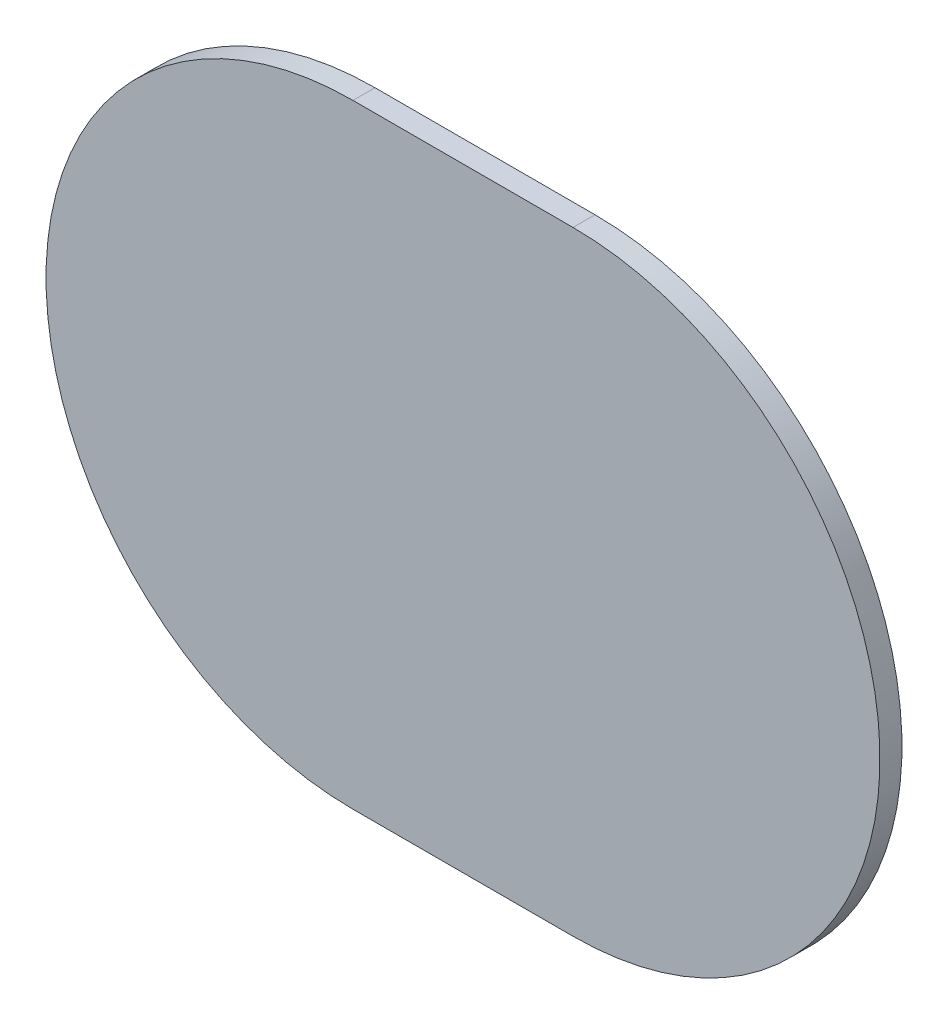
ISO-10303-21;
HEADER;
FILE_DESCRIPTION(('STEP AP214'),'2;1');
FILE_NAME('part.step','',(''),(''),'','','');
FILE_SCHEMA(('AUTOMOTIVE_DESIGN { 1 0 10303 214 1 1 1 1 }'));
ENDSEC;
DATA;
#1=APPLICATION_CONTEXT('core data for automotive mechanical design processes');
#2=APPLICATION_PROTOCOL_DEFINITION('international standard','automotive_design',2000,#1);
#3=PRODUCT_CONTEXT('',#1,'mechanical');
#4=PRODUCT('Part','Part','',(#3));
#5=PRODUCT_RELATED_PRODUCT_CATEGORY('part','',(#4));
#6=PRODUCT_DEFINITION_FORMATION('','',#4);
#7=PRODUCT_DEFINITION_CONTEXT('part definition',#1,'design');
#8=PRODUCT_DEFINITION('design','',#6,#7);
#9=PRODUCT_DEFINITION_SHAPE('','',#8);
#10=(LENGTH_UNIT() NAMED_UNIT(*) SI_UNIT(.MILLI.,.METRE.));
#11=(NAMED_UNIT(*) PLANE_ANGLE_UNIT() SI_UNIT($,.RADIAN.));
#12=(NAMED_UNIT(*) SI_UNIT($,.STERADIAN.) SOLID_ANGLE_UNIT());
#13=UNCERTAINTY_MEASURE_WITH_UNIT(LENGTH_MEASURE(1.E-05),#10,'distance_accuracy_value','');
#14=(GEOMETRIC_REPRESENTATION_CONTEXT(3) GLOBAL_UNCERTAINTY_ASSIGNED_CONTEXT((#13)) GLOBAL_UNIT_ASSIGNED_CONTEXT((#10,
#11,#12)) REPRESENTATION_CONTEXT('',''));
#15=CARTESIAN_POINT('',(0.,0.,0.));
#16=DIRECTION('',(0.,0.,1.));
#17=DIRECTION('',(1.,0.,0.));
#18=AXIS2_PLACEMENT_3D('',#15,#16,#17);
#19=CARTESIAN_POINT('',(-10.,0.,2.));
#20=DIRECTION('',(0.,0.,-1.));
#21=DIRECTION('',(-1.,0.,0.));
#22=AXIS2_PLACEMENT_3D('',#19,#20,#21);
#23=CYLINDRICAL_SURFACE('',#22,27.9);
#24=CARTESIAN_POINT('',(-10.,0.,0.));
#25=DIRECTION('',(0.,0.,1.));
#26=DIRECTION('',(1.,0.,0.));
#27=AXIS2_PLACEMENT_3D('',#24,#25,#26);
#28=CIRCLE('',#27,27.9);
#29=CARTESIAN_POINT('',(-10.,27.9,0.));
#30=VERTEX_POINT('',#29);
#31=CARTESIAN_POINT('',(-10.,-27.9,0.));
#32=VERTEX_POINT('',#31);
#33=EDGE_CURVE('E98',#30,#32,#28,.T.);
#34=ORIENTED_EDGE('',*,*,#33,.T.);
#35=DIRECTION('',(0.,0.,-1.));
#36=VECTOR('',#35,1.);
#37=CARTESIAN_POINT('',(-10.,-27.9,2.));
#38=LINE('',#37,#36);
#39=CARTESIAN_POINT('',(-10.,-27.9,2.));
#40=VERTEX_POINT('',#39);
#41=EDGE_CURVE('E11',#40,#32,#38,.T.);
#42=ORIENTED_EDGE('',*,*,#41,.F.);
#43=CARTESIAN_POINT('',(-10.,0.,2.));
#44=DIRECTION('',(0.,0.,1.));
#45=DIRECTION('',(1.,0.,0.));
#46=AXIS2_PLACEMENT_3D('',#43,#44,#45);
#47=CIRCLE('',#46,27.9);
#48=CARTESIAN_POINT('',(-10.,27.9,2.));
#49=VERTEX_POINT('',#48);
#50=EDGE_CURVE('E86',#49,#40,#47,.T.);
#51=ORIENTED_EDGE('',*,*,#50,.F.);
#52=DIRECTION('',(0.,0.,-1.));
#53=VECTOR('',#52,1.);
#54=CARTESIAN_POINT('',(-10.,27.9,2.));
#55=LINE('',#54,#53);
#56=EDGE_CURVE('E94',#49,#30,#55,.T.);
#57=ORIENTED_EDGE('',*,*,#56,.T.);
#58=EDGE_LOOP('',(#34,#42,#51,#57));
#59=FACE_BOUND('',#58,.T.);
#60=ADVANCED_FACE('F35',(#59),#23,.T.);
#61=CARTESIAN_POINT('',(-10.,-27.9,2.));
#62=DIRECTION('',(0.,1.,0.));
#63=DIRECTION('',(0.,0.,1.));
#64=AXIS2_PLACEMENT_3D('',#61,#62,#63);
#65=PLANE('',#64);
#66=DIRECTION('',(1.,0.,0.));
#67=VECTOR('',#66,1.);
#68=CARTESIAN_POINT('',(-10.,-27.9,0.));
#69=LINE('',#68,#67);
#70=CARTESIAN_POINT('',(10.,-27.9,0.));
#71=VERTEX_POINT('',#70);
#72=EDGE_CURVE('E90',#32,#71,#69,.T.);
#73=ORIENTED_EDGE('',*,*,#72,.T.);
#74=DIRECTION('',(0.,0.,-1.));
#75=VECTOR('',#74,1.);
#76=CARTESIAN_POINT('',(10.,-27.9,2.));
#77=LINE('',#76,#75);
#78=CARTESIAN_POINT('',(10.,-27.9,2.));
#79=VERTEX_POINT('',#78);
#80=EDGE_CURVE('E43',#79,#71,#77,.T.);
#81=ORIENTED_EDGE('',*,*,#80,.F.);
#82=DIRECTION('',(1.,0.,0.));
#83=VECTOR('',#82,1.);
#84=CARTESIAN_POINT('',(-10.,-27.9,2.));
#85=LINE('',#84,#83);
#86=EDGE_CURVE('E81',#40,#79,#85,.T.);
#87=ORIENTED_EDGE('',*,*,#86,.F.);
#88=ORIENTED_EDGE('',*,*,#41,.T.);
#89=EDGE_LOOP('',(#73,#81,#87,#88));
#90=FACE_BOUND('',#89,.T.);
#91=ADVANCED_FACE('F89',(#90),#65,.F.);
#92=CARTESIAN_POINT('',(10.,0.,2.));
#93=DIRECTION('',(0.,0.,-1.));
#94=DIRECTION('',(-1.,0.,0.));
#95=AXIS2_PLACEMENT_3D('',#92,#93,#94);
#96=CYLINDRICAL_SURFACE('',#95,27.9);
#97=CARTESIAN_POINT('',(10.,0.,0.));
#98=DIRECTION('',(0.,0.,1.));
#99=DIRECTION('',(1.,0.,0.));
#100=AXIS2_PLACEMENT_3D('',#97,#98,#99);
#101=CIRCLE('',#100,27.9);
#102=CARTESIAN_POINT('',(10.,27.9,0.));
#103=VERTEX_POINT('',#102);
#104=EDGE_CURVE('E68',#71,#103,#101,.T.);
#105=ORIENTED_EDGE('',*,*,#104,.T.);
#106=DIRECTION('',(0.,0.,-1.));
#107=VECTOR('',#106,1.);
#108=CARTESIAN_POINT('',(10.,27.9,2.));
#109=LINE('',#108,#107);
#110=CARTESIAN_POINT('',(10.,27.9,2.));
#111=VERTEX_POINT('',#110);
#112=EDGE_CURVE('E91',#111,#103,#109,.T.);
#113=ORIENTED_EDGE('',*,*,#112,.F.);
#114=CARTESIAN_POINT('',(10.,0.,2.));
#115=DIRECTION('',(0.,0.,1.));
#116=DIRECTION('',(1.,0.,0.));
#117=AXIS2_PLACEMENT_3D('',#114,#115,#116);
#118=CIRCLE('',#117,27.9);
#119=EDGE_CURVE('E84',#79,#111,#118,.T.);
#120=ORIENTED_EDGE('',*,*,#119,.F.);
#121=ORIENTED_EDGE('',*,*,#80,.T.);
#122=EDGE_LOOP('',(#105,#113,#120,#121));
#123=FACE_BOUND('',#122,.T.);
#124=ADVANCED_FACE('F92',(#123),#96,.T.);
#125=CARTESIAN_POINT('',(10.,27.9,2.));
#126=DIRECTION('',(0.,-1.,0.));
#127=DIRECTION('',(1.,0.,0.));
#128=AXIS2_PLACEMENT_3D('',#125,#126,#127);
#129=PLANE('',#128);
#130=DIRECTION('',(-1.,0.,0.));
#131=VECTOR('',#130,1.);
#132=CARTESIAN_POINT('',(10.,27.9,0.));
#133=LINE('',#132,#131);
#134=EDGE_CURVE('E74',#103,#30,#133,.T.);
#135=ORIENTED_EDGE('',*,*,#134,.T.);
#136=ORIENTED_EDGE('',*,*,#56,.F.);
#137=DIRECTION('',(-1.,0.,0.));
#138=VECTOR('',#137,1.);
#139=CARTESIAN_POINT('',(10.,27.9,2.));
#140=LINE('',#139,#138);
#141=EDGE_CURVE('E51',#111,#49,#140,.T.);
#142=ORIENTED_EDGE('',*,*,#141,.F.);
#143=ORIENTED_EDGE('',*,*,#112,.T.);
#144=EDGE_LOOP('',(#135,#136,#142,#143));
#145=FACE_BOUND('',#144,.T.);
#146=ADVANCED_FACE('F105',(#145),#129,.F.);
#147=CARTESIAN_POINT('',(-10.,0.,2.));
#148=DIRECTION('',(0.,0.,1.));
#149=DIRECTION('',(1.,0.,0.));
#150=AXIS2_PLACEMENT_3D('',#147,#148,#149);
#151=PLANE('',#150);
#152=ORIENTED_EDGE('',*,*,#50,.T.);
#153=ORIENTED_EDGE('',*,*,#86,.T.);
#154=ORIENTED_EDGE('',*,*,#119,.T.);
#155=ORIENTED_EDGE('',*,*,#141,.T.);
#156=EDGE_LOOP('',(#152,#153,#154,#155));
#157=FACE_BOUND('',#156,.T.);
#158=ADVANCED_FACE('F82',(#157),#151,.T.);
#159=CARTESIAN_POINT('',(-10.,0.,0.));
#160=DIRECTION('',(0.,0.,1.));
#161=DIRECTION('',(1.,0.,0.));
#162=AXIS2_PLACEMENT_3D('',#159,#160,#161);
#163=PLANE('',#162);
#164=ORIENTED_EDGE('',*,*,#33,.F.);
#165=ORIENTED_EDGE('',*,*,#134,.F.);
#166=ORIENTED_EDGE('',*,*,#104,.F.);
#167=ORIENTED_EDGE('',*,*,#72,.F.);
#168=EDGE_LOOP('',(#164,#165,#166,#167));
#169=FACE_BOUND('',#168,.T.);
#170=ADVANCED_FACE('F108',(#169),#163,.F.);
#171=CLOSED_SHELL('',(#60,#91,#124,#146,#158,#170));
#172=MANIFOLD_SOLID_BREP('B2',#171);
#173=ADVANCED_BREP_SHAPE_REPRESENTATION('',(#18,#172),#14);
#174=SHAPE_DEFINITION_REPRESENTATION(#9,#173);
ENDSEC;
END-ISO-10303-21;
